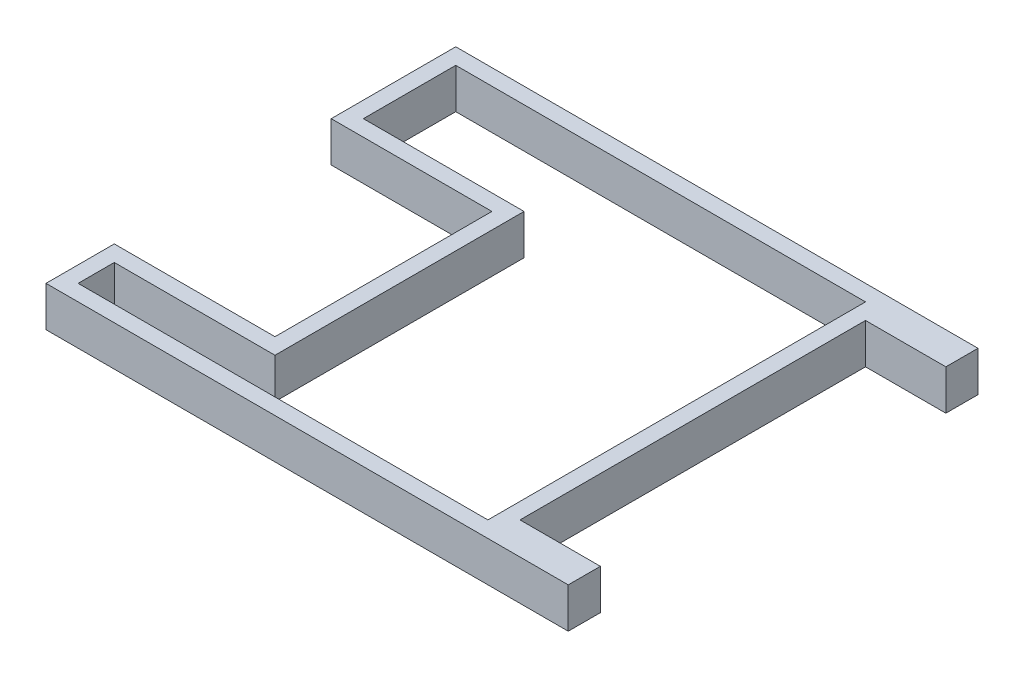
ISO-10303-21;
HEADER;
FILE_DESCRIPTION(('STEP AP214'),'2;1');
FILE_NAME('part.step','',(''),(''),'','','');
FILE_SCHEMA(('AUTOMOTIVE_DESIGN { 1 0 10303 214 1 1 1 1 }'));
ENDSEC;
DATA;
#1=APPLICATION_CONTEXT('core data for automotive mechanical design processes');
#2=APPLICATION_PROTOCOL_DEFINITION('international standard','automotive_design',2000,#1);
#3=PRODUCT_CONTEXT('',#1,'mechanical');
#4=PRODUCT('Part','Part','',(#3));
#5=PRODUCT_RELATED_PRODUCT_CATEGORY('part','',(#4));
#6=PRODUCT_DEFINITION_FORMATION('','',#4);
#7=PRODUCT_DEFINITION_CONTEXT('part definition',#1,'design');
#8=PRODUCT_DEFINITION('design','',#6,#7);
#9=PRODUCT_DEFINITION_SHAPE('','',#8);
#10=(LENGTH_UNIT() NAMED_UNIT(*) SI_UNIT(.MILLI.,.METRE.));
#11=(NAMED_UNIT(*) PLANE_ANGLE_UNIT() SI_UNIT($,.RADIAN.));
#12=(NAMED_UNIT(*) SI_UNIT($,.STERADIAN.) SOLID_ANGLE_UNIT());
#13=UNCERTAINTY_MEASURE_WITH_UNIT(LENGTH_MEASURE(1.E-05),#10,'distance_accuracy_value','');
#14=(GEOMETRIC_REPRESENTATION_CONTEXT(3) GLOBAL_UNCERTAINTY_ASSIGNED_CONTEXT((#13)) GLOBAL_UNIT_ASSIGNED_CONTEXT((#10,
#11,#12)) REPRESENTATION_CONTEXT('',''));
#15=CARTESIAN_POINT('',(0.,0.,0.));
#16=DIRECTION('',(0.,0.,1.));
#17=DIRECTION('',(1.,0.,0.));
#18=AXIS2_PLACEMENT_3D('',#15,#16,#17);
#19=CARTESIAN_POINT('',(0.,5.,0.));
#20=DIRECTION('',(0.,1.,0.));
#21=DIRECTION('',(0.,0.,1.));
#22=AXIS2_PLACEMENT_3D('',#19,#20,#21);
#23=PLANE('',#22);
#24=DIRECTION('',(0.,0.,1.));
#25=VECTOR('',#24,1.);
#26=CARTESIAN_POINT('',(-44.7750722139343,5.,-21.1463963963964));
#27=LINE('',#26,#25);
#28=CARTESIAN_POINT('',(-44.7750722139343,5.,-21.1463963963964));
#29=VERTEX_POINT('',#28);
#30=CARTESIAN_POINT('',(-44.7750722139343,5.,-5.64639639639639));
#31=VERTEX_POINT('',#30);
#32=EDGE_CURVE('E266',#29,#31,#27,.T.);
#33=ORIENTED_EDGE('',*,*,#32,.T.);
#34=DIRECTION('',(1.,0.,0.));
#35=VECTOR('',#34,1.);
#36=CARTESIAN_POINT('',(-44.7750722139343,5.,-5.64639639639639));
#37=LINE('',#36,#35);
#38=CARTESIAN_POINT('',(-24.7750722139343,5.,-5.64639639639638));
#39=VERTEX_POINT('',#38);
#40=EDGE_CURVE('E270',#31,#39,#37,.T.);
#41=ORIENTED_EDGE('',*,*,#40,.T.);
#42=DIRECTION('',(0.,0.,1.));
#43=VECTOR('',#42,1.);
#44=CARTESIAN_POINT('',(-24.7750722139343,5.,-5.64639639639638));
#45=LINE('',#44,#43);
#46=CARTESIAN_POINT('',(-24.7750722139343,5.,21.3536036036036));
#47=VERTEX_POINT('',#46);
#48=EDGE_CURVE('E274',#39,#47,#45,.T.);
#49=ORIENTED_EDGE('',*,*,#48,.T.);
#50=DIRECTION('',(-1.,0.,0.));
#51=VECTOR('',#50,1.);
#52=CARTESIAN_POINT('',(-24.7750722139343,5.,21.3536036036036));
#53=LINE('',#52,#51);
#54=CARTESIAN_POINT('',(-44.7750722139343,5.,21.3536036036036));
#55=VERTEX_POINT('',#54);
#56=EDGE_CURVE('E277',#47,#55,#53,.T.);
#57=ORIENTED_EDGE('',*,*,#56,.T.);
#58=DIRECTION('',(0.,0.,1.));
#59=VECTOR('',#58,1.);
#60=CARTESIAN_POINT('',(-44.7750722139343,5.,21.3536036036036));
#61=LINE('',#60,#59);
#62=CARTESIAN_POINT('',(-44.7750722139343,5.,29.8536036036037));
#63=VERTEX_POINT('',#62);
#64=EDGE_CURVE('E280',#55,#63,#61,.T.);
#65=ORIENTED_EDGE('',*,*,#64,.T.);
#66=DIRECTION('',(1.,0.,0.));
#67=VECTOR('',#66,1.);
#68=CARTESIAN_POINT('',(-44.7750722139343,5.,29.8536036036037));
#69=LINE('',#68,#67);
#70=CARTESIAN_POINT('',(20.2249277860657,5.,29.8536036036036));
#71=VERTEX_POINT('',#70);
#72=EDGE_CURVE('E283',#63,#71,#69,.T.);
#73=ORIENTED_EDGE('',*,*,#72,.T.);
#74=DIRECTION('',(0.,0.,-1.));
#75=VECTOR('',#74,1.);
#76=CARTESIAN_POINT('',(20.2249277860657,5.,25.8536036036036));
#77=LINE('',#76,#75);
#78=CARTESIAN_POINT('',(20.2249277860657,5.,25.8536036036036));
#79=VERTEX_POINT('',#78);
#80=EDGE_CURVE('E286',#71,#79,#77,.T.);
#81=ORIENTED_EDGE('',*,*,#80,.T.);
#82=DIRECTION('',(-1.,0.,0.));
#83=VECTOR('',#82,1.);
#84=CARTESIAN_POINT('',(10.2249277860657,5.,25.8536036036036));
#85=LINE('',#84,#83);
#86=CARTESIAN_POINT('',(10.2249277860657,5.,25.8536036036036));
#87=VERTEX_POINT('',#86);
#88=EDGE_CURVE('E289',#79,#87,#85,.T.);
#89=ORIENTED_EDGE('',*,*,#88,.T.);
#90=DIRECTION('',(0.,0.,-1.));
#91=VECTOR('',#90,1.);
#92=CARTESIAN_POINT('',(10.2249277860657,5.,-17.1463963963964));
#93=LINE('',#92,#91);
#94=CARTESIAN_POINT('',(10.2249277860657,5.,-17.1463963963964));
#95=VERTEX_POINT('',#94);
#96=EDGE_CURVE('E292',#87,#95,#93,.T.);
#97=ORIENTED_EDGE('',*,*,#96,.T.);
#98=DIRECTION('',(1.,0.,0.));
#99=VECTOR('',#98,1.);
#100=CARTESIAN_POINT('',(20.2249277860657,5.,-17.1463963963964));
#101=LINE('',#100,#99);
#102=CARTESIAN_POINT('',(20.2249277860657,5.,-17.1463963963964));
#103=VERTEX_POINT('',#102);
#104=EDGE_CURVE('E295',#95,#103,#101,.T.);
#105=ORIENTED_EDGE('',*,*,#104,.T.);
#106=DIRECTION('',(0.,0.,-1.));
#107=VECTOR('',#106,1.);
#108=CARTESIAN_POINT('',(20.2249277860657,5.,-21.1463963963964));
#109=LINE('',#108,#107);
#110=CARTESIAN_POINT('',(20.2249277860657,5.,-21.1463963963964));
#111=VERTEX_POINT('',#110);
#112=EDGE_CURVE('E298',#103,#111,#109,.T.);
#113=ORIENTED_EDGE('',*,*,#112,.T.);
#114=DIRECTION('',(-1.,0.,0.));
#115=VECTOR('',#114,1.);
#116=CARTESIAN_POINT('',(-44.7750722139343,5.,-21.1463963963964));
#117=LINE('',#116,#115);
#118=EDGE_CURVE('E301',#111,#29,#117,.T.);
#119=ORIENTED_EDGE('',*,*,#118,.T.);
#120=EDGE_LOOP('',(#33,#41,#49,#57,#65,#73,#81,#89,#97,#105,#113,#119));
#121=FACE_BOUND('',#120,.T.);
#122=DIRECTION('',(1.,0.,0.));
#123=VECTOR('',#122,1.);
#124=CARTESIAN_POINT('',(-22.7750722139343,5.,-7.64639639639636));
#125=LINE('',#124,#123);
#126=CARTESIAN_POINT('',(-42.7750722139343,5.,-7.64639639639636));
#127=VERTEX_POINT('',#126);
#128=CARTESIAN_POINT('',(-22.7750722139343,5.,-7.64639639639636));
#129=VERTEX_POINT('',#128);
#130=EDGE_CURVE('E186',#127,#129,#125,.T.);
#131=ORIENTED_EDGE('',*,*,#130,.F.);
#132=DIRECTION('',(0.,0.,1.));
#133=VECTOR('',#132,1.);
#134=CARTESIAN_POINT('',(-42.7750722139343,5.,-7.64639639639636));
#135=LINE('',#134,#133);
#136=CARTESIAN_POINT('',(-42.7750722139343,5.,-19.1463963963964));
#137=VERTEX_POINT('',#136);
#138=EDGE_CURVE('E177',#137,#127,#135,.T.);
#139=ORIENTED_EDGE('',*,*,#138,.F.);
#140=DIRECTION('',(-1.,0.,0.));
#141=VECTOR('',#140,1.);
#142=CARTESIAN_POINT('',(-42.7750722139343,5.,-19.1463963963964));
#143=LINE('',#142,#141);
#144=CARTESIAN_POINT('',(8.22492778606567,5.,-19.1463963963964));
#145=VERTEX_POINT('',#144);
#146=EDGE_CURVE('E218',#145,#137,#143,.T.);
#147=ORIENTED_EDGE('',*,*,#146,.F.);
#148=DIRECTION('',(0.,0.,-1.));
#149=VECTOR('',#148,1.);
#150=CARTESIAN_POINT('',(8.22492778606567,5.,-19.1463963963964));
#151=LINE('',#150,#149);
#152=CARTESIAN_POINT('',(8.22492778606568,5.,27.8536036036036));
#153=VERTEX_POINT('',#152);
#154=EDGE_CURVE('E215',#153,#145,#151,.T.);
#155=ORIENTED_EDGE('',*,*,#154,.F.);
#156=DIRECTION('',(1.,0.,0.));
#157=VECTOR('',#156,1.);
#158=CARTESIAN_POINT('',(8.22492778606568,5.,27.8536036036036));
#159=LINE('',#158,#157);
#160=CARTESIAN_POINT('',(-42.7750722139343,5.,27.8536036036036));
#161=VERTEX_POINT('',#160);
#162=EDGE_CURVE('E212',#161,#153,#159,.T.);
#163=ORIENTED_EDGE('',*,*,#162,.F.);
#164=DIRECTION('',(0.,0.,1.));
#165=VECTOR('',#164,1.);
#166=CARTESIAN_POINT('',(-42.7750722139343,5.,27.8536036036036));
#167=LINE('',#166,#165);
#168=CARTESIAN_POINT('',(-42.7750722139343,5.,23.3536036036036));
#169=VERTEX_POINT('',#168);
#170=EDGE_CURVE('E209',#169,#161,#167,.T.);
#171=ORIENTED_EDGE('',*,*,#170,.F.);
#172=DIRECTION('',(-1.,0.,0.));
#173=VECTOR('',#172,1.);
#174=CARTESIAN_POINT('',(-42.7750722139343,5.,23.3536036036036));
#175=LINE('',#174,#173);
#176=CARTESIAN_POINT('',(-22.7750722139343,5.,23.3536036036037));
#177=VERTEX_POINT('',#176);
#178=EDGE_CURVE('E204',#177,#169,#175,.T.);
#179=ORIENTED_EDGE('',*,*,#178,.F.);
#180=DIRECTION('',(0.,0.,1.));
#181=VECTOR('',#180,1.);
#182=CARTESIAN_POINT('',(-22.7750722139343,5.,23.3536036036037));
#183=LINE('',#182,#181);
#184=EDGE_CURVE('E200',#129,#177,#183,.T.);
#185=ORIENTED_EDGE('',*,*,#184,.F.);
#186=EDGE_LOOP('',(#131,#139,#147,#155,#163,#171,#179,#185));
#187=FACE_BOUND('',#186,.T.);
#188=ADVANCED_FACE('F39',(#121,#187),#23,.T.);
#189=CARTESIAN_POINT('',(0.,0.,0.));
#190=DIRECTION('',(0.,1.,0.));
#191=DIRECTION('',(0.,0.,1.));
#192=AXIS2_PLACEMENT_3D('',#189,#190,#191);
#193=PLANE('',#192);
#194=DIRECTION('',(0.,0.,1.));
#195=VECTOR('',#194,1.);
#196=CARTESIAN_POINT('',(-44.7750722139343,0.,-21.1463963963964));
#197=LINE('',#196,#195);
#198=CARTESIAN_POINT('',(-44.7750722139343,0.,-21.1463963963964));
#199=VERTEX_POINT('',#198);
#200=CARTESIAN_POINT('',(-44.7750722139343,0.,-5.64639639639639));
#201=VERTEX_POINT('',#200);
#202=EDGE_CURVE('E195',#199,#201,#197,.T.);
#203=ORIENTED_EDGE('',*,*,#202,.F.);
#204=DIRECTION('',(-1.,0.,0.));
#205=VECTOR('',#204,1.);
#206=CARTESIAN_POINT('',(-44.7750722139343,0.,-21.1463963963964));
#207=LINE('',#206,#205);
#208=CARTESIAN_POINT('',(20.2249277860657,0.,-21.1463963963964));
#209=VERTEX_POINT('',#208);
#210=EDGE_CURVE('E271',#209,#199,#207,.T.);
#211=ORIENTED_EDGE('',*,*,#210,.F.);
#212=DIRECTION('',(0.,0.,-1.));
#213=VECTOR('',#212,1.);
#214=CARTESIAN_POINT('',(20.2249277860657,0.,-21.1463963963964));
#215=LINE('',#214,#213);
#216=CARTESIAN_POINT('',(20.2249277860657,0.,-17.1463963963964));
#217=VERTEX_POINT('',#216);
#218=EDGE_CURVE('E335',#217,#209,#215,.T.);
#219=ORIENTED_EDGE('',*,*,#218,.F.);
#220=DIRECTION('',(1.,0.,0.));
#221=VECTOR('',#220,1.);
#222=CARTESIAN_POINT('',(20.2249277860657,0.,-17.1463963963964));
#223=LINE('',#222,#221);
#224=CARTESIAN_POINT('',(10.2249277860657,0.,-17.1463963963964));
#225=VERTEX_POINT('',#224);
#226=EDGE_CURVE('E332',#225,#217,#223,.T.);
#227=ORIENTED_EDGE('',*,*,#226,.F.);
#228=DIRECTION('',(0.,0.,-1.));
#229=VECTOR('',#228,1.);
#230=CARTESIAN_POINT('',(10.2249277860657,0.,-17.1463963963964));
#231=LINE('',#230,#229);
#232=CARTESIAN_POINT('',(10.2249277860657,0.,25.8536036036036));
#233=VERTEX_POINT('',#232);
#234=EDGE_CURVE('E329',#233,#225,#231,.T.);
#235=ORIENTED_EDGE('',*,*,#234,.F.);
#236=DIRECTION('',(-1.,0.,0.));
#237=VECTOR('',#236,1.);
#238=CARTESIAN_POINT('',(10.2249277860657,0.,25.8536036036036));
#239=LINE('',#238,#237);
#240=CARTESIAN_POINT('',(20.2249277860657,0.,25.8536036036036));
#241=VERTEX_POINT('',#240);
#242=EDGE_CURVE('E326',#241,#233,#239,.T.);
#243=ORIENTED_EDGE('',*,*,#242,.F.);
#244=DIRECTION('',(0.,0.,-1.));
#245=VECTOR('',#244,1.);
#246=CARTESIAN_POINT('',(20.2249277860657,0.,25.8536036036036));
#247=LINE('',#246,#245);
#248=CARTESIAN_POINT('',(20.2249277860657,0.,29.8536036036036));
#249=VERTEX_POINT('',#248);
#250=EDGE_CURVE('E323',#249,#241,#247,.T.);
#251=ORIENTED_EDGE('',*,*,#250,.F.);
#252=DIRECTION('',(1.,0.,0.));
#253=VECTOR('',#252,1.);
#254=CARTESIAN_POINT('',(-44.7750722139343,0.,29.8536036036037));
#255=LINE('',#254,#253);
#256=CARTESIAN_POINT('',(-44.7750722139343,0.,29.8536036036037));
#257=VERTEX_POINT('',#256);
#258=EDGE_CURVE('E320',#257,#249,#255,.T.);
#259=ORIENTED_EDGE('',*,*,#258,.F.);
#260=DIRECTION('',(0.,0.,1.));
#261=VECTOR('',#260,1.);
#262=CARTESIAN_POINT('',(-44.7750722139343,0.,21.3536036036036));
#263=LINE('',#262,#261);
#264=CARTESIAN_POINT('',(-44.7750722139343,0.,21.3536036036036));
#265=VERTEX_POINT('',#264);
#266=EDGE_CURVE('E317',#265,#257,#263,.T.);
#267=ORIENTED_EDGE('',*,*,#266,.F.);
#268=DIRECTION('',(-1.,0.,0.));
#269=VECTOR('',#268,1.);
#270=CARTESIAN_POINT('',(-24.7750722139343,0.,21.3536036036036));
#271=LINE('',#270,#269);
#272=CARTESIAN_POINT('',(-24.7750722139343,0.,21.3536036036036));
#273=VERTEX_POINT('',#272);
#274=EDGE_CURVE('E314',#273,#265,#271,.T.);
#275=ORIENTED_EDGE('',*,*,#274,.F.);
#276=DIRECTION('',(0.,0.,1.));
#277=VECTOR('',#276,1.);
#278=CARTESIAN_POINT('',(-24.7750722139343,0.,-5.64639639639638));
#279=LINE('',#278,#277);
#280=CARTESIAN_POINT('',(-24.7750722139343,0.,-5.64639639639638));
#281=VERTEX_POINT('',#280);
#282=EDGE_CURVE('E311',#281,#273,#279,.T.);
#283=ORIENTED_EDGE('',*,*,#282,.F.);
#284=DIRECTION('',(1.,0.,0.));
#285=VECTOR('',#284,1.);
#286=CARTESIAN_POINT('',(-44.7750722139343,0.,-5.64639639639639));
#287=LINE('',#286,#285);
#288=EDGE_CURVE('E308',#201,#281,#287,.T.);
#289=ORIENTED_EDGE('',*,*,#288,.F.);
#290=EDGE_LOOP('',(#203,#211,#219,#227,#235,#243,#251,#259,#267,#275,#283,#289));
#291=FACE_BOUND('',#290,.T.);
#292=DIRECTION('',(0.,0.,1.));
#293=VECTOR('',#292,1.);
#294=CARTESIAN_POINT('',(-42.7750722139343,0.,-7.64639639639636));
#295=LINE('',#294,#293);
#296=CARTESIAN_POINT('',(-42.7750722139343,0.,-19.1463963963964));
#297=VERTEX_POINT('',#296);
#298=CARTESIAN_POINT('',(-42.7750722139343,0.,-7.64639639639636));
#299=VERTEX_POINT('',#298);
#300=EDGE_CURVE('E63',#297,#299,#295,.T.);
#301=ORIENTED_EDGE('',*,*,#300,.T.);
#302=DIRECTION('',(1.,0.,0.));
#303=VECTOR('',#302,1.);
#304=CARTESIAN_POINT('',(-22.7750722139343,0.,-7.64639639639636));
#305=LINE('',#304,#303);
#306=CARTESIAN_POINT('',(-22.7750722139343,0.,-7.64639639639636));
#307=VERTEX_POINT('',#306);
#308=EDGE_CURVE('E193',#299,#307,#305,.T.);
#309=ORIENTED_EDGE('',*,*,#308,.T.);
#310=DIRECTION('',(0.,0.,1.));
#311=VECTOR('',#310,1.);
#312=CARTESIAN_POINT('',(-22.7750722139343,0.,23.3536036036037));
#313=LINE('',#312,#311);
#314=CARTESIAN_POINT('',(-22.7750722139343,0.,23.3536036036037));
#315=VERTEX_POINT('',#314);
#316=EDGE_CURVE('E225',#307,#315,#313,.T.);
#317=ORIENTED_EDGE('',*,*,#316,.T.);
#318=DIRECTION('',(-1.,0.,0.));
#319=VECTOR('',#318,1.);
#320=CARTESIAN_POINT('',(-42.7750722139343,0.,23.3536036036036));
#321=LINE('',#320,#319);
#322=CARTESIAN_POINT('',(-42.7750722139343,0.,23.3536036036036));
#323=VERTEX_POINT('',#322);
#324=EDGE_CURVE('E229',#315,#323,#321,.T.);
#325=ORIENTED_EDGE('',*,*,#324,.T.);
#326=DIRECTION('',(0.,0.,1.));
#327=VECTOR('',#326,1.);
#328=CARTESIAN_POINT('',(-42.7750722139343,0.,27.8536036036036));
#329=LINE('',#328,#327);
#330=CARTESIAN_POINT('',(-42.7750722139343,0.,27.8536036036036));
#331=VERTEX_POINT('',#330);
#332=EDGE_CURVE('E233',#323,#331,#329,.T.);
#333=ORIENTED_EDGE('',*,*,#332,.T.);
#334=DIRECTION('',(1.,0.,0.));
#335=VECTOR('',#334,1.);
#336=CARTESIAN_POINT('',(8.22492778606568,0.,27.8536036036036));
#337=LINE('',#336,#335);
#338=CARTESIAN_POINT('',(8.22492778606568,0.,27.8536036036036));
#339=VERTEX_POINT('',#338);
#340=EDGE_CURVE('E237',#331,#339,#337,.T.);
#341=ORIENTED_EDGE('',*,*,#340,.T.);
#342=DIRECTION('',(0.,0.,-1.));
#343=VECTOR('',#342,1.);
#344=CARTESIAN_POINT('',(8.22492778606567,0.,-19.1463963963964));
#345=LINE('',#344,#343);
#346=CARTESIAN_POINT('',(8.22492778606567,0.,-19.1463963963964));
#347=VERTEX_POINT('',#346);
#348=EDGE_CURVE('E241',#339,#347,#345,.T.);
#349=ORIENTED_EDGE('',*,*,#348,.T.);
#350=DIRECTION('',(-1.,0.,0.));
#351=VECTOR('',#350,1.);
#352=CARTESIAN_POINT('',(-42.7750722139343,0.,-19.1463963963964));
#353=LINE('',#352,#351);
#354=EDGE_CURVE('E187',#347,#297,#353,.T.);
#355=ORIENTED_EDGE('',*,*,#354,.T.);
#356=EDGE_LOOP('',(#301,#309,#317,#325,#333,#341,#349,#355));
#357=FACE_BOUND('',#356,.T.);
#358=ADVANCED_FACE('F390',(#291,#357),#193,.F.);
#359=CARTESIAN_POINT('',(-44.7750722139343,5.,-21.1463963963964));
#360=DIRECTION('',(1.,0.,0.));
#361=DIRECTION('',(0.,0.,-1.));
#362=AXIS2_PLACEMENT_3D('',#359,#360,#361);
#363=PLANE('',#362);
#364=ORIENTED_EDGE('',*,*,#202,.T.);
#365=DIRECTION('',(0.,-1.,0.));
#366=VECTOR('',#365,1.);
#367=CARTESIAN_POINT('',(-44.7750722139343,5.,-5.64639639639639));
#368=LINE('',#367,#366);
#369=EDGE_CURVE('E11',#31,#201,#368,.T.);
#370=ORIENTED_EDGE('',*,*,#369,.F.);
#371=ORIENTED_EDGE('',*,*,#32,.F.);
#372=DIRECTION('',(0.,-1.,0.));
#373=VECTOR('',#372,1.);
#374=CARTESIAN_POINT('',(-44.7750722139343,5.,-21.1463963963964));
#375=LINE('',#374,#373);
#376=EDGE_CURVE('E304',#29,#199,#375,.T.);
#377=ORIENTED_EDGE('',*,*,#376,.T.);
#378=EDGE_LOOP('',(#364,#370,#371,#377));
#379=FACE_BOUND('',#378,.T.);
#380=ADVANCED_FACE('F41',(#379),#363,.F.);
#381=CARTESIAN_POINT('',(-44.7750722139343,5.,-5.64639639639639));
#382=DIRECTION('',(0.,0.,-1.));
#383=DIRECTION('',(-1.,0.,0.));
#384=AXIS2_PLACEMENT_3D('',#381,#382,#383);
#385=PLANE('',#384);
#386=ORIENTED_EDGE('',*,*,#288,.T.);
#387=DIRECTION('',(0.,-1.,0.));
#388=VECTOR('',#387,1.);
#389=CARTESIAN_POINT('',(-24.7750722139343,5.,-5.64639639639638));
#390=LINE('',#389,#388);
#391=EDGE_CURVE('E48',#39,#281,#390,.T.);
#392=ORIENTED_EDGE('',*,*,#391,.F.);
#393=ORIENTED_EDGE('',*,*,#40,.F.);
#394=ORIENTED_EDGE('',*,*,#369,.T.);
#395=EDGE_LOOP('',(#386,#392,#393,#394));
#396=FACE_BOUND('',#395,.T.);
#397=ADVANCED_FACE('F407',(#396),#385,.F.);
#398=CARTESIAN_POINT('',(-24.7750722139343,5.,-5.64639639639638));
#399=DIRECTION('',(1.,0.,0.));
#400=DIRECTION('',(0.,0.,-1.));
#401=AXIS2_PLACEMENT_3D('',#398,#399,#400);
#402=PLANE('',#401);
#403=ORIENTED_EDGE('',*,*,#282,.T.);
#404=DIRECTION('',(0.,-1.,0.));
#405=VECTOR('',#404,1.);
#406=CARTESIAN_POINT('',(-24.7750722139343,5.,21.3536036036036));
#407=LINE('',#406,#405);
#408=EDGE_CURVE('E375',#47,#273,#407,.T.);
#409=ORIENTED_EDGE('',*,*,#408,.F.);
#410=ORIENTED_EDGE('',*,*,#48,.F.);
#411=ORIENTED_EDGE('',*,*,#391,.T.);
#412=EDGE_LOOP('',(#403,#409,#410,#411));
#413=FACE_BOUND('',#412,.T.);
#414=ADVANCED_FACE('F384',(#413),#402,.F.);
#415=CARTESIAN_POINT('',(-24.7750722139343,5.,21.3536036036036));
#416=DIRECTION('',(0.,0.,1.));
#417=DIRECTION('',(1.,0.,0.));
#418=AXIS2_PLACEMENT_3D('',#415,#416,#417);
#419=PLANE('',#418);
#420=ORIENTED_EDGE('',*,*,#274,.T.);
#421=DIRECTION('',(0.,-1.,0.));
#422=VECTOR('',#421,1.);
#423=CARTESIAN_POINT('',(-44.7750722139343,5.,21.3536036036036));
#424=LINE('',#423,#422);
#425=EDGE_CURVE('E371',#55,#265,#424,.T.);
#426=ORIENTED_EDGE('',*,*,#425,.F.);
#427=ORIENTED_EDGE('',*,*,#56,.F.);
#428=ORIENTED_EDGE('',*,*,#408,.T.);
#429=EDGE_LOOP('',(#420,#426,#427,#428));
#430=FACE_BOUND('',#429,.T.);
#431=ADVANCED_FACE('F396',(#430),#419,.F.);
#432=CARTESIAN_POINT('',(-44.7750722139343,5.,21.3536036036036));
#433=DIRECTION('',(1.,0.,0.));
#434=DIRECTION('',(0.,0.,-1.));
#435=AXIS2_PLACEMENT_3D('',#432,#433,#434);
#436=PLANE('',#435);
#437=ORIENTED_EDGE('',*,*,#266,.T.);
#438=DIRECTION('',(0.,-1.,0.));
#439=VECTOR('',#438,1.);
#440=CARTESIAN_POINT('',(-44.7750722139343,5.,29.8536036036037));
#441=LINE('',#440,#439);
#442=EDGE_CURVE('E367',#63,#257,#441,.T.);
#443=ORIENTED_EDGE('',*,*,#442,.F.);
#444=ORIENTED_EDGE('',*,*,#64,.F.);
#445=ORIENTED_EDGE('',*,*,#425,.T.);
#446=EDGE_LOOP('',(#437,#443,#444,#445));
#447=FACE_BOUND('',#446,.T.);
#448=ADVANCED_FACE('F400',(#447),#436,.F.);
#449=CARTESIAN_POINT('',(-44.7750722139343,5.,29.8536036036037));
#450=DIRECTION('',(0.,0.,-1.));
#451=DIRECTION('',(-1.,0.,0.));
#452=AXIS2_PLACEMENT_3D('',#449,#450,#451);
#453=PLANE('',#452);
#454=ORIENTED_EDGE('',*,*,#258,.T.);
#455=DIRECTION('',(0.,-1.,0.));
#456=VECTOR('',#455,1.);
#457=CARTESIAN_POINT('',(20.2249277860657,5.,29.8536036036036));
#458=LINE('',#457,#456);
#459=EDGE_CURVE('E363',#71,#249,#458,.T.);
#460=ORIENTED_EDGE('',*,*,#459,.F.);
#461=ORIENTED_EDGE('',*,*,#72,.F.);
#462=ORIENTED_EDGE('',*,*,#442,.T.);
#463=EDGE_LOOP('',(#454,#460,#461,#462));
#464=FACE_BOUND('',#463,.T.);
#465=ADVANCED_FACE('F440',(#464),#453,.F.);
#466=CARTESIAN_POINT('',(20.2249277860657,5.,25.8536036036036));
#467=DIRECTION('',(-1.,0.,0.));
#468=DIRECTION('',(0.,0.,1.));
#469=AXIS2_PLACEMENT_3D('',#466,#467,#468);
#470=PLANE('',#469);
#471=ORIENTED_EDGE('',*,*,#250,.T.);
#472=DIRECTION('',(0.,-1.,0.));
#473=VECTOR('',#472,1.);
#474=CARTESIAN_POINT('',(20.2249277860657,5.,25.8536036036036));
#475=LINE('',#474,#473);
#476=EDGE_CURVE('E359',#79,#241,#475,.T.);
#477=ORIENTED_EDGE('',*,*,#476,.F.);
#478=ORIENTED_EDGE('',*,*,#80,.F.);
#479=ORIENTED_EDGE('',*,*,#459,.T.);
#480=EDGE_LOOP('',(#471,#477,#478,#479));
#481=FACE_BOUND('',#480,.T.);
#482=ADVANCED_FACE('F438',(#481),#470,.F.);
#483=CARTESIAN_POINT('',(10.2249277860657,5.,25.8536036036036));
#484=DIRECTION('',(0.,0.,1.));
#485=DIRECTION('',(1.,0.,0.));
#486=AXIS2_PLACEMENT_3D('',#483,#484,#485);
#487=PLANE('',#486);
#488=ORIENTED_EDGE('',*,*,#242,.T.);
#489=DIRECTION('',(0.,-1.,0.));
#490=VECTOR('',#489,1.);
#491=CARTESIAN_POINT('',(10.2249277860657,5.,25.8536036036036));
#492=LINE('',#491,#490);
#493=EDGE_CURVE('E355',#87,#233,#492,.T.);
#494=ORIENTED_EDGE('',*,*,#493,.F.);
#495=ORIENTED_EDGE('',*,*,#88,.F.);
#496=ORIENTED_EDGE('',*,*,#476,.T.);
#497=EDGE_LOOP('',(#488,#494,#495,#496));
#498=FACE_BOUND('',#497,.T.);
#499=ADVANCED_FACE('F434',(#498),#487,.F.);
#500=CARTESIAN_POINT('',(10.2249277860657,5.,-17.1463963963964));
#501=DIRECTION('',(-1.,0.,0.));
#502=DIRECTION('',(0.,0.,1.));
#503=AXIS2_PLACEMENT_3D('',#500,#501,#502);
#504=PLANE('',#503);
#505=ORIENTED_EDGE('',*,*,#234,.T.);
#506=DIRECTION('',(0.,-1.,0.));
#507=VECTOR('',#506,1.);
#508=CARTESIAN_POINT('',(10.2249277860657,5.,-17.1463963963964));
#509=LINE('',#508,#507);
#510=EDGE_CURVE('E351',#95,#225,#509,.T.);
#511=ORIENTED_EDGE('',*,*,#510,.F.);
#512=ORIENTED_EDGE('',*,*,#96,.F.);
#513=ORIENTED_EDGE('',*,*,#493,.T.);
#514=EDGE_LOOP('',(#505,#511,#512,#513));
#515=FACE_BOUND('',#514,.T.);
#516=ADVANCED_FACE('F429',(#515),#504,.F.);
#517=CARTESIAN_POINT('',(20.2249277860657,5.,-17.1463963963964));
#518=DIRECTION('',(0.,0.,-1.));
#519=DIRECTION('',(-1.,0.,0.));
#520=AXIS2_PLACEMENT_3D('',#517,#518,#519);
#521=PLANE('',#520);
#522=ORIENTED_EDGE('',*,*,#226,.T.);
#523=DIRECTION('',(0.,-1.,0.));
#524=VECTOR('',#523,1.);
#525=CARTESIAN_POINT('',(20.2249277860657,5.,-17.1463963963964));
#526=LINE('',#525,#524);
#527=EDGE_CURVE('E347',#103,#217,#526,.T.);
#528=ORIENTED_EDGE('',*,*,#527,.F.);
#529=ORIENTED_EDGE('',*,*,#104,.F.);
#530=ORIENTED_EDGE('',*,*,#510,.T.);
#531=EDGE_LOOP('',(#522,#528,#529,#530));
#532=FACE_BOUND('',#531,.T.);
#533=ADVANCED_FACE('F423',(#532),#521,.F.);
#534=CARTESIAN_POINT('',(20.2249277860657,5.,-21.1463963963964));
#535=DIRECTION('',(-1.,0.,0.));
#536=DIRECTION('',(0.,0.,1.));
#537=AXIS2_PLACEMENT_3D('',#534,#535,#536);
#538=PLANE('',#537);
#539=ORIENTED_EDGE('',*,*,#218,.T.);
#540=DIRECTION('',(0.,-1.,0.));
#541=VECTOR('',#540,1.);
#542=CARTESIAN_POINT('',(20.2249277860657,5.,-21.1463963963964));
#543=LINE('',#542,#541);
#544=EDGE_CURVE('E343',#111,#209,#543,.T.);
#545=ORIENTED_EDGE('',*,*,#544,.F.);
#546=ORIENTED_EDGE('',*,*,#112,.F.);
#547=ORIENTED_EDGE('',*,*,#527,.T.);
#548=EDGE_LOOP('',(#539,#545,#546,#547));
#549=FACE_BOUND('',#548,.T.);
#550=ADVANCED_FACE('F419',(#549),#538,.F.);
#551=CARTESIAN_POINT('',(-44.7750722139343,5.,-21.1463963963964));
#552=DIRECTION('',(0.,0.,1.));
#553=DIRECTION('',(1.,0.,0.));
#554=AXIS2_PLACEMENT_3D('',#551,#552,#553);
#555=PLANE('',#554);
#556=ORIENTED_EDGE('',*,*,#210,.T.);
#557=ORIENTED_EDGE('',*,*,#376,.F.);
#558=ORIENTED_EDGE('',*,*,#118,.F.);
#559=ORIENTED_EDGE('',*,*,#544,.T.);
#560=EDGE_LOOP('',(#556,#557,#558,#559));
#561=FACE_BOUND('',#560,.T.);
#562=ADVANCED_FACE('F414',(#561),#555,.F.);
#563=CARTESIAN_POINT('',(-42.7750722139343,5.,-7.64639639639636));
#564=DIRECTION('',(1.,0.,0.));
#565=DIRECTION('',(0.,0.,-1.));
#566=AXIS2_PLACEMENT_3D('',#563,#564,#565);
#567=PLANE('',#566);
#568=ORIENTED_EDGE('',*,*,#300,.F.);
#569=DIRECTION('',(0.,-1.,0.));
#570=VECTOR('',#569,1.);
#571=CARTESIAN_POINT('',(-42.7750722139343,5.,-19.1463963963964));
#572=LINE('',#571,#570);
#573=EDGE_CURVE('E181',#137,#297,#572,.T.);
#574=ORIENTED_EDGE('',*,*,#573,.F.);
#575=ORIENTED_EDGE('',*,*,#138,.T.);
#576=DIRECTION('',(0.,-1.,0.));
#577=VECTOR('',#576,1.);
#578=CARTESIAN_POINT('',(-42.7750722139343,5.,-7.64639639639636));
#579=LINE('',#578,#577);
#580=EDGE_CURVE('E180',#127,#299,#579,.T.);
#581=ORIENTED_EDGE('',*,*,#580,.T.);
#582=EDGE_LOOP('',(#568,#574,#575,#581));
#583=FACE_BOUND('',#582,.T.);
#584=ADVANCED_FACE('F179',(#583),#567,.T.);
#585=CARTESIAN_POINT('',(-22.7750722139343,5.,-7.64639639639636));
#586=DIRECTION('',(0.,0.,-1.));
#587=DIRECTION('',(-1.,0.,0.));
#588=AXIS2_PLACEMENT_3D('',#585,#586,#587);
#589=PLANE('',#588);
#590=ORIENTED_EDGE('',*,*,#308,.F.);
#591=ORIENTED_EDGE('',*,*,#580,.F.);
#592=ORIENTED_EDGE('',*,*,#130,.T.);
#593=DIRECTION('',(0.,-1.,0.));
#594=VECTOR('',#593,1.);
#595=CARTESIAN_POINT('',(-22.7750722139343,5.,-7.64639639639636));
#596=LINE('',#595,#594);
#597=EDGE_CURVE('E196',#129,#307,#596,.T.);
#598=ORIENTED_EDGE('',*,*,#597,.T.);
#599=EDGE_LOOP('',(#590,#591,#592,#598));
#600=FACE_BOUND('',#599,.T.);
#601=ADVANCED_FACE('F190',(#600),#589,.T.);
#602=CARTESIAN_POINT('',(-22.7750722139343,5.,23.3536036036037));
#603=DIRECTION('',(1.,0.,0.));
#604=DIRECTION('',(0.,0.,-1.));
#605=AXIS2_PLACEMENT_3D('',#602,#603,#604);
#606=PLANE('',#605);
#607=ORIENTED_EDGE('',*,*,#316,.F.);
#608=ORIENTED_EDGE('',*,*,#597,.F.);
#609=ORIENTED_EDGE('',*,*,#184,.T.);
#610=DIRECTION('',(0.,-1.,0.));
#611=VECTOR('',#610,1.);
#612=CARTESIAN_POINT('',(-22.7750722139343,5.,23.3536036036037));
#613=LINE('',#612,#611);
#614=EDGE_CURVE('E261',#177,#315,#613,.T.);
#615=ORIENTED_EDGE('',*,*,#614,.T.);
#616=EDGE_LOOP('',(#607,#608,#609,#615));
#617=FACE_BOUND('',#616,.T.);
#618=ADVANCED_FACE('F498',(#617),#606,.T.);
#619=CARTESIAN_POINT('',(-42.7750722139343,5.,23.3536036036036));
#620=DIRECTION('',(0.,0.,1.));
#621=DIRECTION('',(1.,0.,0.));
#622=AXIS2_PLACEMENT_3D('',#619,#620,#621);
#623=PLANE('',#622);
#624=ORIENTED_EDGE('',*,*,#324,.F.);
#625=ORIENTED_EDGE('',*,*,#614,.F.);
#626=ORIENTED_EDGE('',*,*,#178,.T.);
#627=DIRECTION('',(0.,-1.,0.));
#628=VECTOR('',#627,1.);
#629=CARTESIAN_POINT('',(-42.7750722139343,5.,23.3536036036036));
#630=LINE('',#629,#628);
#631=EDGE_CURVE('E258',#169,#323,#630,.T.);
#632=ORIENTED_EDGE('',*,*,#631,.T.);
#633=EDGE_LOOP('',(#624,#625,#626,#632));
#634=FACE_BOUND('',#633,.T.);
#635=ADVANCED_FACE('F504',(#634),#623,.T.);
#636=CARTESIAN_POINT('',(-42.7750722139343,5.,27.8536036036036));
#637=DIRECTION('',(1.,0.,0.));
#638=DIRECTION('',(0.,0.,-1.));
#639=AXIS2_PLACEMENT_3D('',#636,#637,#638);
#640=PLANE('',#639);
#641=ORIENTED_EDGE('',*,*,#332,.F.);
#642=ORIENTED_EDGE('',*,*,#631,.F.);
#643=ORIENTED_EDGE('',*,*,#170,.T.);
#644=DIRECTION('',(0.,-1.,0.));
#645=VECTOR('',#644,1.);
#646=CARTESIAN_POINT('',(-42.7750722139343,5.,27.8536036036036));
#647=LINE('',#646,#645);
#648=EDGE_CURVE('E255',#161,#331,#647,.T.);
#649=ORIENTED_EDGE('',*,*,#648,.T.);
#650=EDGE_LOOP('',(#641,#642,#643,#649));
#651=FACE_BOUND('',#650,.T.);
#652=ADVANCED_FACE('F512',(#651),#640,.T.);
#653=CARTESIAN_POINT('',(8.22492778606568,5.,27.8536036036036));
#654=DIRECTION('',(0.,0.,-1.));
#655=DIRECTION('',(-1.,0.,0.));
#656=AXIS2_PLACEMENT_3D('',#653,#654,#655);
#657=PLANE('',#656);
#658=ORIENTED_EDGE('',*,*,#340,.F.);
#659=ORIENTED_EDGE('',*,*,#648,.F.);
#660=ORIENTED_EDGE('',*,*,#162,.T.);
#661=DIRECTION('',(0.,-1.,0.));
#662=VECTOR('',#661,1.);
#663=CARTESIAN_POINT('',(8.22492778606568,5.,27.8536036036036));
#664=LINE('',#663,#662);
#665=EDGE_CURVE('E252',#153,#339,#664,.T.);
#666=ORIENTED_EDGE('',*,*,#665,.T.);
#667=EDGE_LOOP('',(#658,#659,#660,#666));
#668=FACE_BOUND('',#667,.T.);
#669=ADVANCED_FACE('F520',(#668),#657,.T.);
#670=CARTESIAN_POINT('',(8.22492778606567,5.,-19.1463963963964));
#671=DIRECTION('',(-1.,0.,0.));
#672=DIRECTION('',(0.,0.,1.));
#673=AXIS2_PLACEMENT_3D('',#670,#671,#672);
#674=PLANE('',#673);
#675=ORIENTED_EDGE('',*,*,#348,.F.);
#676=ORIENTED_EDGE('',*,*,#665,.F.);
#677=ORIENTED_EDGE('',*,*,#154,.T.);
#678=DIRECTION('',(0.,-1.,0.));
#679=VECTOR('',#678,1.);
#680=CARTESIAN_POINT('',(8.22492778606567,5.,-19.1463963963964));
#681=LINE('',#680,#679);
#682=EDGE_CURVE('E55',#145,#347,#681,.T.);
#683=ORIENTED_EDGE('',*,*,#682,.T.);
#684=EDGE_LOOP('',(#675,#676,#677,#683));
#685=FACE_BOUND('',#684,.T.);
#686=ADVANCED_FACE('F528',(#685),#674,.T.);
#687=CARTESIAN_POINT('',(-42.7750722139343,5.,-19.1463963963964));
#688=DIRECTION('',(0.,0.,1.));
#689=DIRECTION('',(1.,0.,0.));
#690=AXIS2_PLACEMENT_3D('',#687,#688,#689);
#691=PLANE('',#690);
#692=ORIENTED_EDGE('',*,*,#354,.F.);
#693=ORIENTED_EDGE('',*,*,#682,.F.);
#694=ORIENTED_EDGE('',*,*,#146,.T.);
#695=ORIENTED_EDGE('',*,*,#573,.T.);
#696=EDGE_LOOP('',(#692,#693,#694,#695));
#697=FACE_BOUND('',#696,.T.);
#698=ADVANCED_FACE('F536',(#697),#691,.T.);
#699=CLOSED_SHELL('',(#188,#358,#380,#397,#414,#431,#448,#465,#482,#499,#516,#533,#550,#562,
#584,#601,#618,#635,#652,#669,#686,#698));
#700=MANIFOLD_SOLID_BREP('B2',#699);
#701=ADVANCED_BREP_SHAPE_REPRESENTATION('',(#18,#700),#14);
#702=SHAPE_DEFINITION_REPRESENTATION(#9,#701);
ENDSEC;
END-ISO-10303-21;
